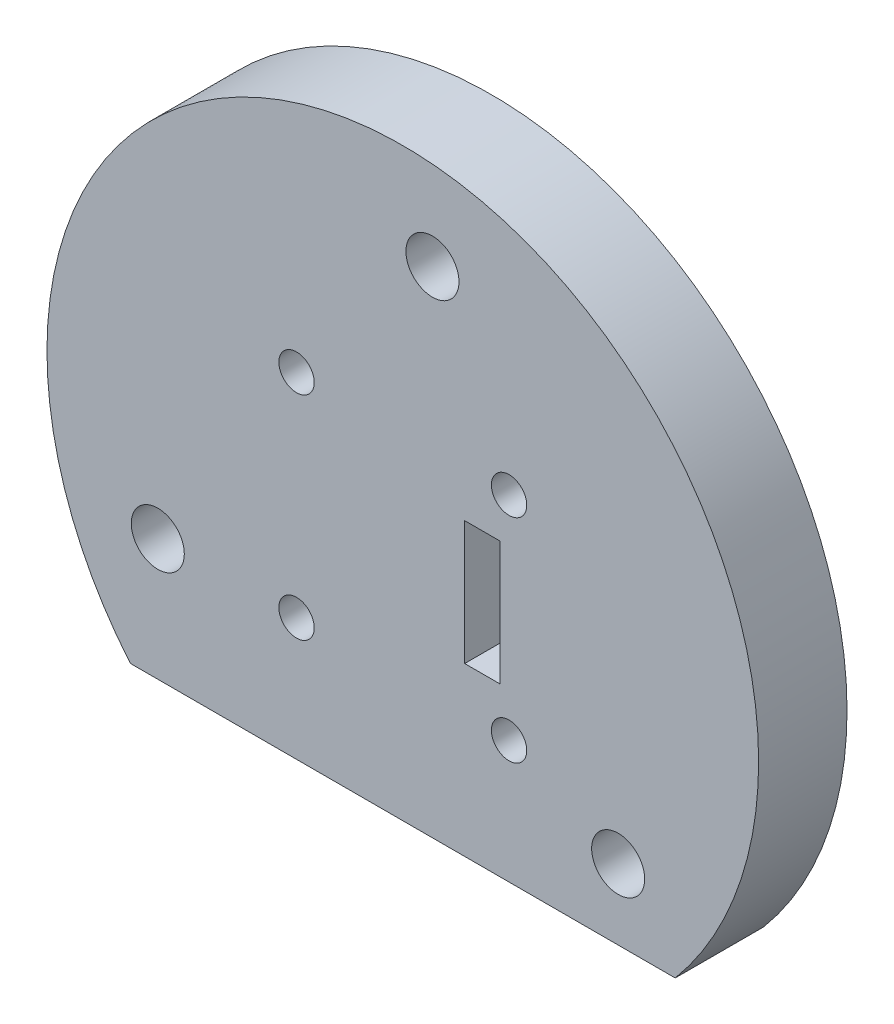
ISO-10303-21;
HEADER;
FILE_DESCRIPTION(('STEP AP214'),'2;1');
FILE_NAME('part.step','',(''),(''),'','','');
FILE_SCHEMA(('AUTOMOTIVE_DESIGN { 1 0 10303 214 1 1 1 1 }'));
ENDSEC;
DATA;
#1=APPLICATION_CONTEXT('core data for automotive mechanical design processes');
#2=APPLICATION_PROTOCOL_DEFINITION('international standard','automotive_design',2000,#1);
#3=PRODUCT_CONTEXT('',#1,'mechanical');
#4=PRODUCT('Part','Part','',(#3));
#5=PRODUCT_RELATED_PRODUCT_CATEGORY('part','',(#4));
#6=PRODUCT_DEFINITION_FORMATION('','',#4);
#7=PRODUCT_DEFINITION_CONTEXT('part definition',#1,'design');
#8=PRODUCT_DEFINITION('design','',#6,#7);
#9=PRODUCT_DEFINITION_SHAPE('','',#8);
#10=(LENGTH_UNIT() NAMED_UNIT(*) SI_UNIT(.MILLI.,.METRE.));
#11=(NAMED_UNIT(*) PLANE_ANGLE_UNIT() SI_UNIT($,.RADIAN.));
#12=(NAMED_UNIT(*) SI_UNIT($,.STERADIAN.) SOLID_ANGLE_UNIT());
#13=UNCERTAINTY_MEASURE_WITH_UNIT(LENGTH_MEASURE(1.E-05),#10,'distance_accuracy_value','');
#14=(GEOMETRIC_REPRESENTATION_CONTEXT(3) GLOBAL_UNCERTAINTY_ASSIGNED_CONTEXT((#13)) GLOBAL_UNIT_ASSIGNED_CONTEXT((#10,
#11,#12)) REPRESENTATION_CONTEXT('',''));
#15=CARTESIAN_POINT('',(0.,0.,0.));
#16=DIRECTION('',(0.,0.,1.));
#17=DIRECTION('',(1.,0.,0.));
#18=AXIS2_PLACEMENT_3D('',#15,#16,#17);
#19=CARTESIAN_POINT('',(-4.66343679776693,-47.05,5.));
#20=DIRECTION('',(0.,0.,1.));
#21=DIRECTION('',(1.,0.,0.));
#22=AXIS2_PLACEMENT_3D('',#19,#20,#21);
#23=PLANE('',#22);
#24=CARTESIAN_POINT('',(-10.6738444378526,-53.0604076400857,5.));
#25=DIRECTION('',(0.,0.,1.));
#26=DIRECTION('',(1.,0.,0.));
#27=AXIS2_PLACEMENT_3D('',#24,#25,#26);
#28=CIRCLE('',#27,1.);
#29=CARTESIAN_POINT('',(-9.67384443785257,-53.0604076400857,5.));
#30=VERTEX_POINT('',#29);
#31=EDGE_CURVE('E300',#30,#30,#28,.T.);
#32=ORIENTED_EDGE('',*,*,#31,.F.);
#33=EDGE_LOOP('',(#32));
#34=FACE_BOUND('',#33,.T.);
#35=CARTESIAN_POINT('',(-2.98693584717454,-32.015363278044,5.));
#36=DIRECTION('',(0.,0.,1.));
#37=DIRECTION('',(1.,0.,0.));
#38=AXIS2_PLACEMENT_3D('',#35,#36,#37);
#39=CIRCLE('',#38,1.5);
#40=CARTESIAN_POINT('',(-1.48693584717454,-32.015363278044,5.));
#41=VERTEX_POINT('',#40);
#42=EDGE_CURVE('E312',#41,#41,#39,.T.);
#43=ORIENTED_EDGE('',*,*,#42,.F.);
#44=EDGE_LOOP('',(#43));
#45=FACE_BOUND('',#44,.T.);
#46=CARTESIAN_POINT('',(7.51869006482119,-56.0192107736598,5.));
#47=DIRECTION('',(0.,0.,1.));
#48=DIRECTION('',(1.,0.,0.));
#49=AXIS2_PLACEMENT_3D('',#46,#47,#48);
#50=CIRCLE('',#49,1.5);
#51=CARTESIAN_POINT('',(9.01869006482119,-56.0192107736598,5.));
#52=VERTEX_POINT('',#51);
#53=EDGE_CURVE('E113',#52,#52,#50,.T.);
#54=ORIENTED_EDGE('',*,*,#53,.F.);
#55=EDGE_LOOP('',(#54));
#56=FACE_BOUND('',#55,.T.);
#57=CARTESIAN_POINT('',(1.34697084231872,-41.0395923599144,5.));
#58=DIRECTION('',(0.,0.,1.));
#59=DIRECTION('',(1.,0.,0.));
#60=AXIS2_PLACEMENT_3D('',#57,#58,#59);
#61=CIRCLE('',#60,1.);
#62=CARTESIAN_POINT('',(2.34697084231873,-41.0395923599144,5.));
#63=VERTEX_POINT('',#62);
#64=EDGE_CURVE('E123',#63,#63,#61,.T.);
#65=ORIENTED_EDGE('',*,*,#64,.F.);
#66=EDGE_LOOP('',(#65));
#67=FACE_BOUND('',#66,.T.);
#68=CARTESIAN_POINT('',(-4.66343679776693,-47.05,5.));
#69=DIRECTION('',(0.,0.,1.));
#70=DIRECTION('',(1.,0.,0.));
#71=AXIS2_PLACEMENT_3D('',#68,#69,#70);
#72=CIRCLE('',#71,20.1278206228963);
#73=CARTESIAN_POINT('',(10.7452186603678,-59.9999999999994,5.));
#74=VERTEX_POINT('',#73);
#75=CARTESIAN_POINT('',(-20.0720922559016,-59.9999999999994,5.));
#76=VERTEX_POINT('',#75);
#77=EDGE_CURVE('E129',#74,#76,#72,.T.);
#78=ORIENTED_EDGE('',*,*,#77,.T.);
#79=DIRECTION('',(1.,0.,0.));
#80=VECTOR('',#79,1.);
#81=CARTESIAN_POINT('',(10.7452186603678,-59.9999999999994,5.));
#82=LINE('',#81,#80);
#83=EDGE_CURVE('E132',#76,#74,#82,.T.);
#84=ORIENTED_EDGE('',*,*,#83,.T.);
#85=EDGE_LOOP('',(#78,#84));
#86=FACE_BOUND('',#85,.T.);
#87=DIRECTION('',(1.,0.,0.));
#88=VECTOR('',#87,1.);
#89=CARTESIAN_POINT('',(-1.16343679776693,-50.55,5.));
#90=LINE('',#89,#88);
#91=CARTESIAN_POINT('',(-1.16343679776693,-50.55,5.));
#92=VERTEX_POINT('',#91);
#93=CARTESIAN_POINT('',(0.836563202233072,-50.55,5.));
#94=VERTEX_POINT('',#93);
#95=EDGE_CURVE('E92',#92,#94,#90,.T.);
#96=ORIENTED_EDGE('',*,*,#95,.F.);
#97=DIRECTION('',(0.,-1.,0.));
#98=VECTOR('',#97,1.);
#99=CARTESIAN_POINT('',(-1.16343679776693,-43.55,5.));
#100=LINE('',#99,#98);
#101=CARTESIAN_POINT('',(-1.16343679776693,-43.55,5.));
#102=VERTEX_POINT('',#101);
#103=EDGE_CURVE('E84',#102,#92,#100,.T.);
#104=ORIENTED_EDGE('',*,*,#103,.F.);
#105=DIRECTION('',(-1.,0.,0.));
#106=VECTOR('',#105,1.);
#107=CARTESIAN_POINT('',(-1.16343679776693,-43.55,5.));
#108=LINE('',#107,#106);
#109=CARTESIAN_POINT('',(0.836563202233071,-43.55,5.));
#110=VERTEX_POINT('',#109);
#111=EDGE_CURVE('E107',#110,#102,#108,.T.);
#112=ORIENTED_EDGE('',*,*,#111,.F.);
#113=DIRECTION('',(0.,1.,0.));
#114=VECTOR('',#113,1.);
#115=CARTESIAN_POINT('',(0.836563202233071,-43.55,5.));
#116=LINE('',#115,#114);
#117=EDGE_CURVE('E105',#94,#110,#116,.T.);
#118=ORIENTED_EDGE('',*,*,#117,.F.);
#119=EDGE_LOOP('',(#96,#104,#112,#118));
#120=FACE_BOUND('',#119,.T.);
#121=CARTESIAN_POINT('',(-18.5220646109474,-53.1154259482963,5.));
#122=DIRECTION('',(0.,0.,1.));
#123=DIRECTION('',(1.,0.,0.));
#124=AXIS2_PLACEMENT_3D('',#121,#122,#123);
#125=CIRCLE('',#124,1.5);
#126=CARTESIAN_POINT('',(-17.0220646109474,-53.1154259482963,5.));
#127=VERTEX_POINT('',#126);
#128=EDGE_CURVE('E318',#127,#127,#125,.T.);
#129=ORIENTED_EDGE('',*,*,#128,.F.);
#130=EDGE_LOOP('',(#129));
#131=FACE_BOUND('',#130,.T.);
#132=CARTESIAN_POINT('',(1.34697084231872,-53.0604076400857,5.));
#133=DIRECTION('',(0.,0.,1.));
#134=DIRECTION('',(1.,0.,0.));
#135=AXIS2_PLACEMENT_3D('',#132,#133,#134);
#136=CIRCLE('',#135,1.);
#137=CARTESIAN_POINT('',(2.34697084231873,-53.0604076400857,5.));
#138=VERTEX_POINT('',#137);
#139=EDGE_CURVE('E306',#138,#138,#136,.T.);
#140=ORIENTED_EDGE('',*,*,#139,.F.);
#141=EDGE_LOOP('',(#140));
#142=FACE_BOUND('',#141,.T.);
#143=CARTESIAN_POINT('',(-10.6738444378526,-41.0395923599144,5.));
#144=DIRECTION('',(0.,0.,1.));
#145=DIRECTION('',(1.,0.,0.));
#146=AXIS2_PLACEMENT_3D('',#143,#144,#145);
#147=CIRCLE('',#146,1.);
#148=CARTESIAN_POINT('',(-9.67384443785258,-41.0395923599144,5.));
#149=VERTEX_POINT('',#148);
#150=EDGE_CURVE('E291',#149,#149,#147,.T.);
#151=ORIENTED_EDGE('',*,*,#150,.F.);
#152=EDGE_LOOP('',(#151));
#153=FACE_BOUND('',#152,.T.);
#154=ADVANCED_FACE('F31',(#34,#45,#56,#67,#86,#120,#131,#142,#153),#23,.T.);
#155=CARTESIAN_POINT('',(-4.66343679776693,-47.05,0.));
#156=DIRECTION('',(0.,0.,1.));
#157=DIRECTION('',(1.,0.,0.));
#158=AXIS2_PLACEMENT_3D('',#155,#156,#157);
#159=PLANE('',#158);
#160=CARTESIAN_POINT('',(-10.6738444378526,-53.0604076400857,0.));
#161=DIRECTION('',(0.,0.,1.));
#162=DIRECTION('',(1.,0.,0.));
#163=AXIS2_PLACEMENT_3D('',#160,#161,#162);
#164=CIRCLE('',#163,1.);
#165=CARTESIAN_POINT('',(-9.67384443785257,-53.0604076400857,0.));
#166=VERTEX_POINT('',#165);
#167=EDGE_CURVE('E297',#166,#166,#164,.T.);
#168=ORIENTED_EDGE('',*,*,#167,.T.);
#169=EDGE_LOOP('',(#168));
#170=FACE_BOUND('',#169,.T.);
#171=CARTESIAN_POINT('',(-2.98693584717454,-32.015363278044,0.));
#172=DIRECTION('',(0.,0.,1.));
#173=DIRECTION('',(1.,0.,0.));
#174=AXIS2_PLACEMENT_3D('',#171,#172,#173);
#175=CIRCLE('',#174,1.5);
#176=CARTESIAN_POINT('',(-1.48693584717454,-32.015363278044,0.));
#177=VERTEX_POINT('',#176);
#178=EDGE_CURVE('E309',#177,#177,#175,.T.);
#179=ORIENTED_EDGE('',*,*,#178,.T.);
#180=EDGE_LOOP('',(#179));
#181=FACE_BOUND('',#180,.T.);
#182=CARTESIAN_POINT('',(7.51869006482119,-56.0192107736598,0.));
#183=DIRECTION('',(0.,0.,1.));
#184=DIRECTION('',(1.,0.,0.));
#185=AXIS2_PLACEMENT_3D('',#182,#183,#184);
#186=CIRCLE('',#185,1.5);
#187=CARTESIAN_POINT('',(9.01869006482119,-56.0192107736598,0.));
#188=VERTEX_POINT('',#187);
#189=EDGE_CURVE('E321',#188,#188,#186,.T.);
#190=ORIENTED_EDGE('',*,*,#189,.T.);
#191=EDGE_LOOP('',(#190));
#192=FACE_BOUND('',#191,.T.);
#193=CARTESIAN_POINT('',(1.34697084231872,-41.0395923599144,0.));
#194=DIRECTION('',(0.,0.,1.));
#195=DIRECTION('',(1.,0.,0.));
#196=AXIS2_PLACEMENT_3D('',#193,#194,#195);
#197=CIRCLE('',#196,1.);
#198=CARTESIAN_POINT('',(2.34697084231873,-41.0395923599144,0.));
#199=VERTEX_POINT('',#198);
#200=EDGE_CURVE('E100',#199,#199,#197,.T.);
#201=ORIENTED_EDGE('',*,*,#200,.T.);
#202=EDGE_LOOP('',(#201));
#203=FACE_BOUND('',#202,.T.);
#204=CARTESIAN_POINT('',(-4.66343679776693,-47.05,0.));
#205=DIRECTION('',(0.,0.,1.));
#206=DIRECTION('',(1.,0.,0.));
#207=AXIS2_PLACEMENT_3D('',#204,#205,#206);
#208=CIRCLE('',#207,20.1278206228963);
#209=CARTESIAN_POINT('',(10.7452186603678,-59.9999999999994,0.));
#210=VERTEX_POINT('',#209);
#211=CARTESIAN_POINT('',(-20.0720922559016,-59.9999999999994,0.));
#212=VERTEX_POINT('',#211);
#213=EDGE_CURVE('E126',#210,#212,#208,.T.);
#214=ORIENTED_EDGE('',*,*,#213,.F.);
#215=DIRECTION('',(1.,0.,0.));
#216=VECTOR('',#215,1.);
#217=CARTESIAN_POINT('',(10.7452186603678,-59.9999999999994,0.));
#218=LINE('',#217,#216);
#219=EDGE_CURVE('E133',#212,#210,#218,.T.);
#220=ORIENTED_EDGE('',*,*,#219,.F.);
#221=EDGE_LOOP('',(#214,#220));
#222=FACE_BOUND('',#221,.T.);
#223=DIRECTION('',(0.,-1.,0.));
#224=VECTOR('',#223,1.);
#225=CARTESIAN_POINT('',(-1.16343679776693,-43.55,0.));
#226=LINE('',#225,#224);
#227=CARTESIAN_POINT('',(-1.16343679776693,-43.55,0.));
#228=VERTEX_POINT('',#227);
#229=CARTESIAN_POINT('',(-1.16343679776693,-50.55,0.));
#230=VERTEX_POINT('',#229);
#231=EDGE_CURVE('E54',#228,#230,#226,.T.);
#232=ORIENTED_EDGE('',*,*,#231,.T.);
#233=DIRECTION('',(1.,0.,0.));
#234=VECTOR('',#233,1.);
#235=CARTESIAN_POINT('',(-1.16343679776693,-50.55,0.));
#236=LINE('',#235,#234);
#237=CARTESIAN_POINT('',(0.836563202233072,-50.55,0.));
#238=VERTEX_POINT('',#237);
#239=EDGE_CURVE('E99',#230,#238,#236,.T.);
#240=ORIENTED_EDGE('',*,*,#239,.T.);
#241=DIRECTION('',(0.,1.,0.));
#242=VECTOR('',#241,1.);
#243=CARTESIAN_POINT('',(0.836563202233071,-43.55,0.));
#244=LINE('',#243,#242);
#245=CARTESIAN_POINT('',(0.836563202233071,-43.55,0.));
#246=VERTEX_POINT('',#245);
#247=EDGE_CURVE('E115',#238,#246,#244,.T.);
#248=ORIENTED_EDGE('',*,*,#247,.T.);
#249=DIRECTION('',(-1.,0.,0.));
#250=VECTOR('',#249,1.);
#251=CARTESIAN_POINT('',(-1.16343679776693,-43.55,0.));
#252=LINE('',#251,#250);
#253=EDGE_CURVE('E93',#246,#228,#252,.T.);
#254=ORIENTED_EDGE('',*,*,#253,.T.);
#255=EDGE_LOOP('',(#232,#240,#248,#254));
#256=FACE_BOUND('',#255,.T.);
#257=CARTESIAN_POINT('',(-18.5220646109474,-53.1154259482963,0.));
#258=DIRECTION('',(0.,0.,1.));
#259=DIRECTION('',(1.,0.,0.));
#260=AXIS2_PLACEMENT_3D('',#257,#258,#259);
#261=CIRCLE('',#260,1.5);
#262=CARTESIAN_POINT('',(-17.0220646109474,-53.1154259482963,0.));
#263=VERTEX_POINT('',#262);
#264=EDGE_CURVE('E315',#263,#263,#261,.T.);
#265=ORIENTED_EDGE('',*,*,#264,.T.);
#266=EDGE_LOOP('',(#265));
#267=FACE_BOUND('',#266,.T.);
#268=CARTESIAN_POINT('',(1.34697084231872,-53.0604076400857,0.));
#269=DIRECTION('',(0.,0.,1.));
#270=DIRECTION('',(1.,0.,0.));
#271=AXIS2_PLACEMENT_3D('',#268,#269,#270);
#272=CIRCLE('',#271,1.);
#273=CARTESIAN_POINT('',(2.34697084231873,-53.0604076400857,0.));
#274=VERTEX_POINT('',#273);
#275=EDGE_CURVE('E303',#274,#274,#272,.T.);
#276=ORIENTED_EDGE('',*,*,#275,.T.);
#277=EDGE_LOOP('',(#276));
#278=FACE_BOUND('',#277,.T.);
#279=CARTESIAN_POINT('',(-10.6738444378526,-41.0395923599144,0.));
#280=DIRECTION('',(0.,0.,1.));
#281=DIRECTION('',(1.,0.,0.));
#282=AXIS2_PLACEMENT_3D('',#279,#280,#281);
#283=CIRCLE('',#282,1.);
#284=CARTESIAN_POINT('',(-9.67384443785258,-41.0395923599144,0.));
#285=VERTEX_POINT('',#284);
#286=EDGE_CURVE('E294',#285,#285,#283,.T.);
#287=ORIENTED_EDGE('',*,*,#286,.T.);
#288=EDGE_LOOP('',(#287));
#289=FACE_BOUND('',#288,.T.);
#290=ADVANCED_FACE('F145',(#170,#181,#192,#203,#222,#256,#267,#278,#289),#159,.F.);
#291=CARTESIAN_POINT('',(-4.66343679776693,-47.05,5.));
#292=DIRECTION('',(0.,0.,-1.));
#293=DIRECTION('',(-1.,0.,0.));
#294=AXIS2_PLACEMENT_3D('',#291,#292,#293);
#295=CYLINDRICAL_SURFACE('',#294,20.1278206228963);
#296=ORIENTED_EDGE('',*,*,#213,.T.);
#297=DIRECTION('',(0.,0.,-1.));
#298=VECTOR('',#297,1.);
#299=CARTESIAN_POINT('',(-20.0720922559016,-59.9999999999994,5.));
#300=LINE('',#299,#298);
#301=EDGE_CURVE('E11',#76,#212,#300,.T.);
#302=ORIENTED_EDGE('',*,*,#301,.F.);
#303=ORIENTED_EDGE('',*,*,#77,.F.);
#304=DIRECTION('',(0.,0.,-1.));
#305=VECTOR('',#304,1.);
#306=CARTESIAN_POINT('',(10.7452186603678,-59.9999999999994,5.));
#307=LINE('',#306,#305);
#308=EDGE_CURVE('E39',#74,#210,#307,.T.);
#309=ORIENTED_EDGE('',*,*,#308,.T.);
#310=EDGE_LOOP('',(#296,#302,#303,#309));
#311=FACE_BOUND('',#310,.T.);
#312=ADVANCED_FACE('F33',(#311),#295,.T.);
#313=CARTESIAN_POINT('',(10.7452186603678,-59.9999999999994,5.));
#314=DIRECTION('',(0.,1.,0.));
#315=DIRECTION('',(-1.,0.,0.));
#316=AXIS2_PLACEMENT_3D('',#313,#314,#315);
#317=PLANE('',#316);
#318=ORIENTED_EDGE('',*,*,#219,.T.);
#319=ORIENTED_EDGE('',*,*,#308,.F.);
#320=ORIENTED_EDGE('',*,*,#83,.F.);
#321=ORIENTED_EDGE('',*,*,#301,.T.);
#322=EDGE_LOOP('',(#318,#319,#320,#321));
#323=FACE_BOUND('',#322,.T.);
#324=ADVANCED_FACE('F147',(#323),#317,.F.);
#325=CARTESIAN_POINT('',(1.34697084231872,-41.0395923599144,5.));
#326=DIRECTION('',(0.,0.,-1.));
#327=DIRECTION('',(-1.,0.,0.));
#328=AXIS2_PLACEMENT_3D('',#325,#326,#327);
#329=CYLINDRICAL_SURFACE('',#328,1.);
#330=ORIENTED_EDGE('',*,*,#64,.T.);
#331=EDGE_LOOP('',(#330));
#332=FACE_BOUND('',#331,.T.);
#333=ORIENTED_EDGE('',*,*,#200,.F.);
#334=EDGE_LOOP('',(#333));
#335=FACE_BOUND('',#334,.T.);
#336=ADVANCED_FACE('F160',(#332,#335),#329,.F.);
#337=CARTESIAN_POINT('',(-1.16343679776693,-43.55,5.));
#338=DIRECTION('',(1.,0.,0.));
#339=DIRECTION('',(0.,1.,0.));
#340=AXIS2_PLACEMENT_3D('',#337,#338,#339);
#341=PLANE('',#340);
#342=ORIENTED_EDGE('',*,*,#231,.F.);
#343=DIRECTION('',(0.,0.,-1.));
#344=VECTOR('',#343,1.);
#345=CARTESIAN_POINT('',(-1.16343679776693,-43.55,5.));
#346=LINE('',#345,#344);
#347=EDGE_CURVE('E88',#102,#228,#346,.T.);
#348=ORIENTED_EDGE('',*,*,#347,.F.);
#349=ORIENTED_EDGE('',*,*,#103,.T.);
#350=DIRECTION('',(0.,0.,-1.));
#351=VECTOR('',#350,1.);
#352=CARTESIAN_POINT('',(-1.16343679776693,-50.55,5.));
#353=LINE('',#352,#351);
#354=EDGE_CURVE('E87',#92,#230,#353,.T.);
#355=ORIENTED_EDGE('',*,*,#354,.T.);
#356=EDGE_LOOP('',(#342,#348,#349,#355));
#357=FACE_BOUND('',#356,.T.);
#358=ADVANCED_FACE('F86',(#357),#341,.T.);
#359=CARTESIAN_POINT('',(-1.16343679776693,-50.55,5.));
#360=DIRECTION('',(0.,1.,0.));
#361=DIRECTION('',(0.,0.,1.));
#362=AXIS2_PLACEMENT_3D('',#359,#360,#361);
#363=PLANE('',#362);
#364=ORIENTED_EDGE('',*,*,#239,.F.);
#365=ORIENTED_EDGE('',*,*,#354,.F.);
#366=ORIENTED_EDGE('',*,*,#95,.T.);
#367=DIRECTION('',(0.,0.,-1.));
#368=VECTOR('',#367,1.);
#369=CARTESIAN_POINT('',(0.836563202233072,-50.55,5.));
#370=LINE('',#369,#368);
#371=EDGE_CURVE('E101',#94,#238,#370,.T.);
#372=ORIENTED_EDGE('',*,*,#371,.T.);
#373=EDGE_LOOP('',(#364,#365,#366,#372));
#374=FACE_BOUND('',#373,.T.);
#375=ADVANCED_FACE('F96',(#374),#363,.T.);
#376=CARTESIAN_POINT('',(0.836563202233071,-43.55,5.));
#377=DIRECTION('',(-1.,0.,0.));
#378=DIRECTION('',(0.,-1.,0.));
#379=AXIS2_PLACEMENT_3D('',#376,#377,#378);
#380=PLANE('',#379);
#381=ORIENTED_EDGE('',*,*,#247,.F.);
#382=ORIENTED_EDGE('',*,*,#371,.F.);
#383=ORIENTED_EDGE('',*,*,#117,.T.);
#384=DIRECTION('',(0.,0.,-1.));
#385=VECTOR('',#384,1.);
#386=CARTESIAN_POINT('',(0.836563202233071,-43.55,5.));
#387=LINE('',#386,#385);
#388=EDGE_CURVE('E46',#110,#246,#387,.T.);
#389=ORIENTED_EDGE('',*,*,#388,.T.);
#390=EDGE_LOOP('',(#381,#382,#383,#389));
#391=FACE_BOUND('',#390,.T.);
#392=ADVANCED_FACE('F205',(#391),#380,.T.);
#393=CARTESIAN_POINT('',(-1.16343679776693,-43.55,5.));
#394=DIRECTION('',(0.,-1.,0.));
#395=DIRECTION('',(0.,0.,-1.));
#396=AXIS2_PLACEMENT_3D('',#393,#394,#395);
#397=PLANE('',#396);
#398=ORIENTED_EDGE('',*,*,#253,.F.);
#399=ORIENTED_EDGE('',*,*,#388,.F.);
#400=ORIENTED_EDGE('',*,*,#111,.T.);
#401=ORIENTED_EDGE('',*,*,#347,.T.);
#402=EDGE_LOOP('',(#398,#399,#400,#401));
#403=FACE_BOUND('',#402,.T.);
#404=ADVANCED_FACE('F213',(#403),#397,.T.);
#405=CARTESIAN_POINT('',(7.51869006482119,-56.0192107736598,5.));
#406=DIRECTION('',(0.,0.,-1.));
#407=DIRECTION('',(-1.,0.,0.));
#408=AXIS2_PLACEMENT_3D('',#405,#406,#407);
#409=CYLINDRICAL_SURFACE('',#408,1.5);
#410=ORIENTED_EDGE('',*,*,#53,.T.);
#411=EDGE_LOOP('',(#410));
#412=FACE_BOUND('',#411,.T.);
#413=ORIENTED_EDGE('',*,*,#189,.F.);
#414=EDGE_LOOP('',(#413));
#415=FACE_BOUND('',#414,.T.);
#416=ADVANCED_FACE('F222',(#412,#415),#409,.F.);
#417=CARTESIAN_POINT('',(-18.5220646109474,-53.1154259482963,5.));
#418=DIRECTION('',(0.,0.,-1.));
#419=DIRECTION('',(-1.,0.,0.));
#420=AXIS2_PLACEMENT_3D('',#417,#418,#419);
#421=CYLINDRICAL_SURFACE('',#420,1.5);
#422=ORIENTED_EDGE('',*,*,#128,.T.);
#423=EDGE_LOOP('',(#422));
#424=FACE_BOUND('',#423,.T.);
#425=ORIENTED_EDGE('',*,*,#264,.F.);
#426=EDGE_LOOP('',(#425));
#427=FACE_BOUND('',#426,.T.);
#428=ADVANCED_FACE('F230',(#424,#427),#421,.F.);
#429=CARTESIAN_POINT('',(-2.98693584717454,-32.015363278044,5.));
#430=DIRECTION('',(0.,0.,-1.));
#431=DIRECTION('',(-1.,0.,0.));
#432=AXIS2_PLACEMENT_3D('',#429,#430,#431);
#433=CYLINDRICAL_SURFACE('',#432,1.5);
#434=ORIENTED_EDGE('',*,*,#42,.T.);
#435=EDGE_LOOP('',(#434));
#436=FACE_BOUND('',#435,.T.);
#437=ORIENTED_EDGE('',*,*,#178,.F.);
#438=EDGE_LOOP('',(#437));
#439=FACE_BOUND('',#438,.T.);
#440=ADVANCED_FACE('F239',(#436,#439),#433,.F.);
#441=CARTESIAN_POINT('',(1.34697084231872,-53.0604076400857,5.));
#442=DIRECTION('',(0.,0.,-1.));
#443=DIRECTION('',(-1.,0.,0.));
#444=AXIS2_PLACEMENT_3D('',#441,#442,#443);
#445=CYLINDRICAL_SURFACE('',#444,1.);
#446=ORIENTED_EDGE('',*,*,#139,.T.);
#447=EDGE_LOOP('',(#446));
#448=FACE_BOUND('',#447,.T.);
#449=ORIENTED_EDGE('',*,*,#275,.F.);
#450=EDGE_LOOP('',(#449));
#451=FACE_BOUND('',#450,.T.);
#452=ADVANCED_FACE('F248',(#448,#451),#445,.F.);
#453=CARTESIAN_POINT('',(-10.6738444378526,-53.0604076400857,5.));
#454=DIRECTION('',(0.,0.,-1.));
#455=DIRECTION('',(-1.,0.,0.));
#456=AXIS2_PLACEMENT_3D('',#453,#454,#455);
#457=CYLINDRICAL_SURFACE('',#456,1.);
#458=ORIENTED_EDGE('',*,*,#31,.T.);
#459=EDGE_LOOP('',(#458));
#460=FACE_BOUND('',#459,.T.);
#461=ORIENTED_EDGE('',*,*,#167,.F.);
#462=EDGE_LOOP('',(#461));
#463=FACE_BOUND('',#462,.T.);
#464=ADVANCED_FACE('F257',(#460,#463),#457,.F.);
#465=CARTESIAN_POINT('',(-10.6738444378526,-41.0395923599144,5.));
#466=DIRECTION('',(0.,0.,-1.));
#467=DIRECTION('',(-1.,0.,0.));
#468=AXIS2_PLACEMENT_3D('',#465,#466,#467);
#469=CYLINDRICAL_SURFACE('',#468,1.);
#470=ORIENTED_EDGE('',*,*,#150,.T.);
#471=EDGE_LOOP('',(#470));
#472=FACE_BOUND('',#471,.T.);
#473=ORIENTED_EDGE('',*,*,#286,.F.);
#474=EDGE_LOOP('',(#473));
#475=FACE_BOUND('',#474,.T.);
#476=ADVANCED_FACE('F266',(#472,#475),#469,.F.);
#477=CLOSED_SHELL('',(#154,#290,#312,#324,#336,#358,#375,#392,#404,#416,#428,#440,#452,#464,#476));
#478=MANIFOLD_SOLID_BREP('B2',#477);
#479=ADVANCED_BREP_SHAPE_REPRESENTATION('',(#18,#478),#14);
#480=SHAPE_DEFINITION_REPRESENTATION(#9,#479);
ENDSEC;
END-ISO-10303-21;
